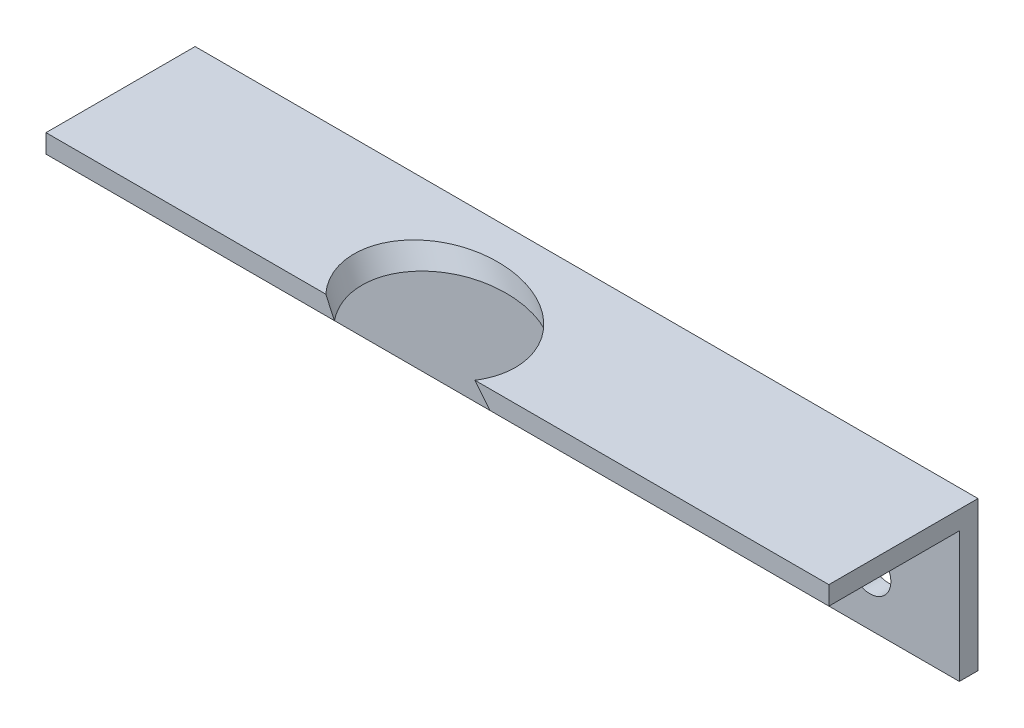
ISO-10303-21;
HEADER;
FILE_DESCRIPTION(('STEP AP214'),'2;1');
FILE_NAME('part.step','',(''),(''),'','','');
FILE_SCHEMA(('AUTOMOTIVE_DESIGN { 1 0 10303 214 1 1 1 1 }'));
ENDSEC;
DATA;
#1=APPLICATION_CONTEXT('core data for automotive mechanical design processes');
#2=APPLICATION_PROTOCOL_DEFINITION('international standard','automotive_design',2000,#1);
#3=PRODUCT_CONTEXT('',#1,'mechanical');
#4=PRODUCT('Part','Part','',(#3));
#5=PRODUCT_RELATED_PRODUCT_CATEGORY('part','',(#4));
#6=PRODUCT_DEFINITION_FORMATION('','',#4);
#7=PRODUCT_DEFINITION_CONTEXT('part definition',#1,'design');
#8=PRODUCT_DEFINITION('design','',#6,#7);
#9=PRODUCT_DEFINITION_SHAPE('','',#8);
#10=(LENGTH_UNIT() NAMED_UNIT(*) SI_UNIT(.MILLI.,.METRE.));
#11=(NAMED_UNIT(*) PLANE_ANGLE_UNIT() SI_UNIT($,.RADIAN.));
#12=(NAMED_UNIT(*) SI_UNIT($,.STERADIAN.) SOLID_ANGLE_UNIT());
#13=UNCERTAINTY_MEASURE_WITH_UNIT(LENGTH_MEASURE(1.E-05),#10,'distance_accuracy_value','');
#14=(GEOMETRIC_REPRESENTATION_CONTEXT(3) GLOBAL_UNCERTAINTY_ASSIGNED_CONTEXT((#13)) GLOBAL_UNIT_ASSIGNED_CONTEXT((#10,
#11,#12)) REPRESENTATION_CONTEXT('',''));
#15=CARTESIAN_POINT('',(0.,0.,0.));
#16=DIRECTION('',(0.,0.,1.));
#17=DIRECTION('',(1.,0.,0.));
#18=AXIS2_PLACEMENT_3D('',#15,#16,#17);
#19=CARTESIAN_POINT('',(133.35,25.4,25.4));
#20=DIRECTION('',(0.,0.,-1.));
#21=DIRECTION('',(0.,1.,0.));
#22=AXIS2_PLACEMENT_3D('',#19,#20,#21);
#23=PLANE('',#22);
#24=DIRECTION('',(-1.,0.,0.));
#25=VECTOR('',#24,1.);
#26=CARTESIAN_POINT('',(133.35,25.4,25.4));
#27=LINE('',#26,#25);
#28=CARTESIAN_POINT('',(133.35,25.4,25.4));
#29=VERTEX_POINT('',#28);
#30=CARTESIAN_POINT('',(73.0648161363002,25.4,25.4));
#31=VERTEX_POINT('',#30);
#32=EDGE_CURVE('E169',#29,#31,#27,.T.);
#33=ORIENTED_EDGE('',*,*,#32,.T.);
#34=CARTESIAN_POINT('',(73.0648161363002,25.4,25.4));
#35=CARTESIAN_POINT('',(73.2070336013631,25.2247044358889,25.4));
#36=CARTESIAN_POINT('',(73.3490179533257,25.0492197795969,25.4));
#37=CARTESIAN_POINT('',(73.6325244490646,24.6978812985424,25.4));
#38=CARTESIAN_POINT('',(73.7740465988834,24.522027478656,25.4));
#39=CARTESIAN_POINT('',(74.0566355429504,24.1699562036177,25.4));
#40=CARTESIAN_POINT('',(74.1977023400888,23.9937387507857,25.4));
#41=CARTESIAN_POINT('',(74.479386965378,23.640945447082,25.4));
#42=CARTESIAN_POINT('',(74.620004793638,23.4643695962976,25.4));
#43=CARTESIAN_POINT('',(74.9007977315109,23.1108643466204,25.4));
#44=CARTESIAN_POINT('',(75.0409728381942,22.9339349454006,25.4));
#45=CARTESIAN_POINT('',(75.3208861592879,22.5797271952436,25.4));
#46=CARTESIAN_POINT('',(75.4606243680735,22.4024488418614,25.4));
#47=CARTESIAN_POINT('',(75.6001457103721,22.225,25.4));
#48=B_SPLINE_CURVE_WITH_KNOTS('',3,(#34,#35,#36,#37,#38,#39,#40,#41,#42,#43,#44,#45,#46,#47),
.UNSPECIFIED.,.F.,.F.,(4,2,2,2,2,2,4),(0.,0.677191818269251,1.35437474757687,2.03155336996906,
2.70873182749302,3.38591475678608,4.06310636882168),.UNSPECIFIED.);
#49=CARTESIAN_POINT('',(75.6001457103721,22.225,25.4));
#50=VERTEX_POINT('',#49);
#51=EDGE_CURVE('E211',#31,#50,#48,.T.);
#52=ORIENTED_EDGE('',*,*,#51,.T.);
#53=DIRECTION('',(-1.,0.,0.));
#54=VECTOR('',#53,1.);
#55=CARTESIAN_POINT('',(133.35,22.225,25.4));
#56=LINE('',#55,#54);
#57=CARTESIAN_POINT('',(133.35,22.225,25.4));
#58=VERTEX_POINT('',#57);
#59=EDGE_CURVE('E165',#58,#50,#56,.T.);
#60=ORIENTED_EDGE('',*,*,#59,.F.);
#61=DIRECTION('',(0.,-1.,0.));
#62=VECTOR('',#61,1.);
#63=CARTESIAN_POINT('',(133.35,25.4,25.4));
#64=LINE('',#63,#62);
#65=EDGE_CURVE('E115',#29,#58,#64,.T.);
#66=ORIENTED_EDGE('',*,*,#65,.F.);
#67=EDGE_LOOP('',(#33,#52,#60,#66));
#68=FACE_BOUND('',#67,.T.);
#69=ADVANCED_FACE('F37',(#68),#23,.F.);
#70=CARTESIAN_POINT('',(133.35,0.,0.));
#71=DIRECTION('',(0.,0.,1.));
#72=DIRECTION('',(1.,0.,0.));
#73=AXIS2_PLACEMENT_3D('',#70,#71,#72);
#74=PLANE('',#73);
#75=CARTESIAN_POINT('',(118.11,8.89000000000001,0.));
#76=DIRECTION('',(0.,0.,-1.));
#77=DIRECTION('',(-1.,0.,0.));
#78=AXIS2_PLACEMENT_3D('',#75,#76,#77);
#79=CIRCLE('',#78,3.57124000000001);
#80=CARTESIAN_POINT('',(114.53876,8.89000000000001,0.));
#81=VERTEX_POINT('',#80);
#82=EDGE_CURVE('E251',#81,#81,#79,.T.);
#83=ORIENTED_EDGE('',*,*,#82,.F.);
#84=EDGE_LOOP('',(#83));
#85=FACE_BOUND('',#84,.T.);
#86=CARTESIAN_POINT('',(15.24,8.89000000000001,0.));
#87=DIRECTION('',(0.,0.,-1.));
#88=DIRECTION('',(-1.,0.,0.));
#89=AXIS2_PLACEMENT_3D('',#86,#87,#88);
#90=CIRCLE('',#89,3.57124);
#91=CARTESIAN_POINT('',(11.66876,8.89000000000001,0.));
#92=VERTEX_POINT('',#91);
#93=EDGE_CURVE('E254',#92,#92,#90,.T.);
#94=ORIENTED_EDGE('',*,*,#93,.F.);
#95=EDGE_LOOP('',(#94));
#96=FACE_BOUND('',#95,.T.);
#97=DIRECTION('',(0.,1.,0.));
#98=VECTOR('',#97,1.);
#99=CARTESIAN_POINT('',(0.,0.,0.));
#100=LINE('',#99,#98);
#101=CARTESIAN_POINT('',(0.,0.,0.));
#102=VERTEX_POINT('',#101);
#103=CARTESIAN_POINT('',(0.,25.4,0.));
#104=VERTEX_POINT('',#103);
#105=EDGE_CURVE('E140',#102,#104,#100,.T.);
#106=ORIENTED_EDGE('',*,*,#105,.T.);
#107=DIRECTION('',(-1.,0.,0.));
#108=VECTOR('',#107,1.);
#109=CARTESIAN_POINT('',(133.35,25.4,0.));
#110=LINE('',#109,#108);
#111=CARTESIAN_POINT('',(133.35,25.4,0.));
#112=VERTEX_POINT('',#111);
#113=EDGE_CURVE('E47',#112,#104,#110,.T.);
#114=ORIENTED_EDGE('',*,*,#113,.F.);
#115=DIRECTION('',(0.,1.,0.));
#116=VECTOR('',#115,1.);
#117=CARTESIAN_POINT('',(133.35,0.,0.));
#118=LINE('',#117,#116);
#119=CARTESIAN_POINT('',(133.35,0.,0.));
#120=VERTEX_POINT('',#119);
#121=EDGE_CURVE('E160',#120,#112,#118,.T.);
#122=ORIENTED_EDGE('',*,*,#121,.F.);
#123=DIRECTION('',(-1.,0.,0.));
#124=VECTOR('',#123,1.);
#125=CARTESIAN_POINT('',(133.35,0.,0.));
#126=LINE('',#125,#124);
#127=EDGE_CURVE('E136',#120,#102,#126,.T.);
#128=ORIENTED_EDGE('',*,*,#127,.T.);
#129=EDGE_LOOP('',(#106,#114,#122,#128));
#130=FACE_BOUND('',#129,.T.);
#131=ADVANCED_FACE('F39',(#85,#96,#130),#74,.F.);
#132=CARTESIAN_POINT('',(133.35,25.4,0.));
#133=DIRECTION('',(0.,-1.,0.));
#134=DIRECTION('',(0.,0.,-1.));
#135=AXIS2_PLACEMENT_3D('',#132,#133,#134);
#136=PLANE('',#135);
#137=CARTESIAN_POINT('',(47.651098940411,25.4,25.4));
#138=VERTEX_POINT('',#137);
#139=CARTESIAN_POINT('',(0.,25.4,25.4));
#140=VERTEX_POINT('',#139);
#141=EDGE_CURVE('E168',#138,#140,#27,.T.);
#142=ORIENTED_EDGE('',*,*,#141,.F.);
#143=CARTESIAN_POINT('',(47.651098940411,25.4,25.4));
#144=CARTESIAN_POINT('',(47.3957745346794,25.4,25.1241435050767));
#145=CARTESIAN_POINT('',(47.1503502529683,25.4,24.8389554639527));
#146=CARTESIAN_POINT('',(46.6816118515027,25.4,24.2504210438661));
#147=CARTESIAN_POINT('',(46.4583244209419,25.4,23.9470534368024));
#148=CARTESIAN_POINT('',(46.0354741172725,25.4,23.3213783581046));
#149=CARTESIAN_POINT('',(45.8360681145288,25.3999999999999,22.9989644370529));
#150=CARTESIAN_POINT('',(45.4656079118157,25.4000000000001,22.338364644139));
#151=CARTESIAN_POINT('',(45.2945401507536,25.4000000000003,22.0001864160526));
#152=CARTESIAN_POINT('',(45.0093621175642,25.4000000000003,21.3667068007728));
#153=CARTESIAN_POINT('',(44.8905111916545,25.4000000000001,21.0735360046358));
#154=CARTESIAN_POINT('',(44.676441193358,25.3999999999999,20.4787063660787));
#155=CARTESIAN_POINT('',(44.5812177242553,25.4,20.1770491145106));
#156=CARTESIAN_POINT('',(44.416324877774,25.4,19.5675360482811));
#157=CARTESIAN_POINT('',(44.3465978900992,25.4,19.2596958868446));
#158=CARTESIAN_POINT('',(44.2340052086818,25.4,18.6391119520649));
#159=CARTESIAN_POINT('',(44.1911393066595,25.4,18.3263682167631));
#160=CARTESIAN_POINT('',(44.1334341716628,25.4,17.6959913162075));
#161=CARTESIAN_POINT('',(44.1188000107815,25.4,17.3783391458675));
#162=CARTESIAN_POINT('',(44.1192180869035,25.4,16.743023621244));
#163=CARTESIAN_POINT('',(44.1342707915166,25.4,16.4253602668632));
#164=CARTESIAN_POINT('',(44.1946261042405,25.4,15.7928825186459));
#165=CARTESIAN_POINT('',(44.2399308519523,25.4,15.4780683279153));
#166=CARTESIAN_POINT('',(44.3607911157029,25.4,14.8543143122505));
#167=CARTESIAN_POINT('',(44.4363434089798,25.3999999999999,14.5453738651631));
#168=CARTESIAN_POINT('',(44.6070661478737,25.3999999999999,13.9700389724805));
#169=CARTESIAN_POINT('',(44.6991395790599,25.4,13.7027201868495));
#170=CARTESIAN_POINT('',(44.9058959114281,25.4,13.1769973519833));
#171=CARTESIAN_POINT('',(45.0205768437646,25.4,12.9185925287485));
#172=CARTESIAN_POINT('',(45.2713920063703,25.4,12.4124921980199));
#173=CARTESIAN_POINT('',(45.4075220603384,25.4,12.1647946176869));
#174=CARTESIAN_POINT('',(45.6998627277487,25.4,11.6815549796125));
#175=CARTESIAN_POINT('',(45.8560739322806,25.3999999999999,11.446013279966));
#176=CARTESIAN_POINT('',(46.1862957883442,25.3999999999999,10.9892972120463));
#177=CARTESIAN_POINT('',(46.3602283904693,25.4,10.768066308643));
#178=CARTESIAN_POINT('',(46.7247715264638,25.4,10.3398334927784));
#179=CARTESIAN_POINT('',(46.9153818160247,25.4,10.1328313719617));
#180=CARTESIAN_POINT('',(47.3115939760528,25.4,9.73371877781506));
#181=CARTESIAN_POINT('',(47.5171965201907,25.4,9.54160897446642));
#182=CARTESIAN_POINT('',(47.9417804404931,25.4,9.17266413512444));
#183=CARTESIAN_POINT('',(48.1607667933561,25.4,8.99583484083409));
#184=CARTESIAN_POINT('',(48.6367570760347,25.4,8.63797730683725));
#185=CARTESIAN_POINT('',(48.8952114743451,25.4,8.45887808009613));
#186=CARTESIAN_POINT('',(49.4246767425631,25.4,8.12016614937321));
#187=CARTESIAN_POINT('',(49.6956920745958,25.4,7.96056044457287));
#188=CARTESIAN_POINT('',(50.2483202489952,25.4,7.66075383994852));
#189=CARTESIAN_POINT('',(50.5299358327953,25.4,7.52055800436588));
#190=CARTESIAN_POINT('',(51.1019098824199,25.4,7.25937431043989));
#191=CARTESIAN_POINT('',(51.3922685003664,25.4,7.13838678653627));
#192=CARTESIAN_POINT('',(52.0355869492545,25.4,6.89422992959515));
#193=CARTESIAN_POINT('',(52.3900265039483,25.4,6.77495153639395));
#194=CARTESIAN_POINT('',(53.1066209038311,25.4,6.56236407408152));
#195=CARTESIAN_POINT('',(53.4687770576098,25.4,6.46905944797704));
#196=CARTESIAN_POINT('',(54.1988294376026,25.4,6.30767849873315));
#197=CARTESIAN_POINT('',(54.5667280100647,25.4,6.23961278469015));
#198=CARTESIAN_POINT('',(55.30615174063,25.4,6.12803442053704));
#199=CARTESIAN_POINT('',(55.6776772692381,25.4,6.0845243061314));
#200=CARTESIAN_POINT('',(56.9486191877868,25.4000000000001,5.97681181626898));
#201=CARTESIAN_POINT('',(57.8536996832355,25.4,5.96994211136881));
#202=CARTESIAN_POINT('',(59.2038667292724,25.4,6.05713042602846));
#203=CARTESIAN_POINT('',(59.6529496108058,25.4,6.10249903082242));
#204=CARTESIAN_POINT('',(60.5467942217753,25.4,6.22486014381137));
#205=CARTESIAN_POINT('',(60.9915557644664,25.4,6.30185401251277));
#206=CARTESIAN_POINT('',(62.4542311215869,25.4,6.60816579005159));
#207=CARTESIAN_POINT('',(63.4592313451971,25.4,6.90485829134611));
#208=CARTESIAN_POINT('',(64.9201185566939,25.4,7.46807740507603));
#209=CARTESIAN_POINT('',(65.3997725533471,25.4,7.67578332709123));
#210=CARTESIAN_POINT('',(66.340442724342,25.4,8.13022535329702));
#211=CARTESIAN_POINT('',(66.8014593700985,25.3999999999999,8.37696046950333));
#212=CARTESIAN_POINT('',(67.7168543427941,25.3999999999999,8.9183208905547));
#213=CARTESIAN_POINT('',(68.1704083223577,25.4,9.21434125930097));
#214=CARTESIAN_POINT('',(69.0484935460787,25.4,9.84698369114202));
#215=CARTESIAN_POINT('',(69.4730195813463,25.4,10.1836130114672));
#216=CARTESIAN_POINT('',(70.2865698955632,25.4,10.8958150464788));
#217=CARTESIAN_POINT('',(70.6756665621386,25.4000000000001,11.271304847203));
#218=CARTESIAN_POINT('',(71.4129091017594,25.3999999999999,12.0604392441411));
#219=CARTESIAN_POINT('',(71.7610782588166,25.3999999999998,12.474061904899));
#220=CARTESIAN_POINT('',(72.2978439893038,25.3999999999998,13.1889275349846));
#221=CARTESIAN_POINT('',(72.5001599039683,25.3999999999999,13.479941529146));
#222=CARTESIAN_POINT('',(72.8818061894936,25.4,14.0766353915728));
#223=CARTESIAN_POINT('',(73.0611429458664,25.4,14.3823111529956));
#224=CARTESIAN_POINT('',(73.3944165432353,25.4,15.0071498752301));
#225=CARTESIAN_POINT('',(73.5483596577557,25.4,15.3263094802965));
#226=CARTESIAN_POINT('',(73.828401430225,25.4,15.9766850907509));
#227=CARTESIAN_POINT('',(73.9544989106838,25.4000000000001,16.3079016052919));
#228=CARTESIAN_POINT('',(74.1773597839842,25.4000000000001,16.9835885326796));
#229=CARTESIAN_POINT('',(74.2738352892753,25.4,17.3281544883002));
#230=CARTESIAN_POINT('',(74.433351199548,25.4,18.0249836957624));
#231=CARTESIAN_POINT('',(74.4963907491147,25.4,18.3772471442943));
#232=CARTESIAN_POINT('',(74.5868042281271,25.4,19.0861603107788));
#233=CARTESIAN_POINT('',(74.6142066487967,25.4,19.4428062943962));
#234=CARTESIAN_POINT('',(74.6273915130932,25.4,19.9782769850329));
#235=CARTESIAN_POINT('',(74.6271336695838,25.4,20.156846689583));
#236=CARTESIAN_POINT('',(74.6171875416403,25.4,20.5137851484772));
#237=CARTESIAN_POINT('',(74.6074963362539,25.4,20.6921538234476));
#238=CARTESIAN_POINT('',(74.5684745149755,25.4000000000001,21.1723946163316));
#239=CARTESIAN_POINT('',(74.5301577030664,25.4,21.4735808516351));
#240=CARTESIAN_POINT('',(74.4259069505556,25.4,22.0711183743775));
#241=CARTESIAN_POINT('',(74.3599763400528,25.4,22.3674702403436));
#242=CARTESIAN_POINT('',(74.2407643794668,25.4,22.8062286656857));
#243=CARTESIAN_POINT('',(74.1976617600681,25.4,22.951464546165));
#244=CARTESIAN_POINT('',(74.1047970442933,25.4,23.2397467435607));
#245=CARTESIAN_POINT('',(74.0550366530686,25.4,23.3827936106959));
#246=CARTESIAN_POINT('',(73.8959607927593,25.4,23.8081498286697));
#247=CARTESIAN_POINT('',(73.7767994864737,25.3999999999999,24.0868627850923));
#248=CARTESIAN_POINT('',(73.5587953191721,25.3999999999999,24.5386531775513));
#249=CARTESIAN_POINT('',(73.4669926650247,25.4,24.7151869092686));
#250=CARTESIAN_POINT('',(73.2733436861968,25.4,25.0621649954835));
#251=CARTESIAN_POINT('',(73.1715192008577,25.4000000000001,25.2326215346914));
#252=CARTESIAN_POINT('',(73.0648161363003,25.4000000000001,25.4));
#253=B_SPLINE_CURVE_WITH_KNOTS('',3,(#143,#144,#145,#146,#147,#148,#149,#150,#151,#152,#153,
#154,#155,#156,#157,#158,#159,#160,#161,#162,#163,#164,#165,#166,#167,#168,#169,#170,#171,#172,
#173,#174,#175,#176,#177,#178,#179,#180,#181,#182,#183,#184,#185,#186,#187,#188,#189,#190,#191,
#192,#193,#194,#195,#196,#197,#198,#199,#200,#201,#202,#203,#204,#205,#206,#207,#208,#209,#210,
#211,#212,#213,#214,#215,#216,#217,#218,#219,#220,#221,#222,#223,#224,#225,#226,#227,#228,#229,
#230,#231,#232,#233,#234,#235,#236,#237,#238,#239,#240,#241,#242,#243,#244,#245,#246,#247,#248,
#249,#250,#251,#252),.UNSPECIFIED.,.F.,.F.,(4,2,2,2,2,2,2,2,2,2,2,2,2,2,2,2,2,2,2,2,2,2,2,2,2,2,
2,2,2,2,2,2,2,2,2,2,2,2,2,2,2,2,2,2,2,2,2,2,2,2,2,2,2,2,4),(0.,1.12758668726248,
2.25651672085047,3.39249701992397,4.52793212224962,5.47604740753571,6.4239861302274,
7.36976951574977,8.31554556761839,9.26816613550684,10.2208017086195,11.1735046648099,
12.1261061410954,12.9732695701696,13.8203592539115,14.6672842064377,15.5142340939484,
16.3576030367731,17.2009596273093,18.044354137097,18.8880641895753,19.8304809056186,
20.7732350093562,21.7162346259796,22.6592506595569,23.7800958102409,24.9011325722057,
26.0226400256519,27.1442632690366,29.8474445583232,31.2006738928204,32.5539614488095,
35.6811698352822,37.2479395795039,38.8146696688909,40.4373240324204,42.0602688114886,
43.6798195510239,45.298444408759,46.3608160794819,47.4228918922388,48.4847049238652,
49.546562847092,50.6184358952681,51.6903363645815,52.7613793414505,53.2968760060102,
53.8325385348649,54.7420480629733,55.6514479399243,56.1057946019038,56.5600251211106,
57.4679038780101,58.0645247392434,58.659873092881),.UNSPECIFIED.);
#254=EDGE_CURVE('E145',#138,#31,#253,.T.);
#255=ORIENTED_EDGE('',*,*,#254,.T.);
#256=ORIENTED_EDGE('',*,*,#32,.F.);
#257=DIRECTION('',(0.,0.,1.));
#258=VECTOR('',#257,1.);
#259=CARTESIAN_POINT('',(133.35,25.4,0.));
#260=LINE('',#259,#258);
#261=EDGE_CURVE('E99',#112,#29,#260,.T.);
#262=ORIENTED_EDGE('',*,*,#261,.F.);
#263=ORIENTED_EDGE('',*,*,#113,.T.);
#264=DIRECTION('',(0.,0.,1.));
#265=VECTOR('',#264,1.);
#266=CARTESIAN_POINT('',(0.,25.4,0.));
#267=LINE('',#266,#265);
#268=EDGE_CURVE('E144',#104,#140,#267,.T.);
#269=ORIENTED_EDGE('',*,*,#268,.T.);
#270=EDGE_LOOP('',(#142,#255,#256,#262,#263,#269));
#271=FACE_BOUND('',#270,.T.);
#272=ADVANCED_FACE('F226',(#271),#136,.F.);
#273=CARTESIAN_POINT('',(49.139274790246,22.225,25.4));
#274=VERTEX_POINT('',#273);
#275=CARTESIAN_POINT('',(0.,22.225,25.4));
#276=VERTEX_POINT('',#275);
#277=EDGE_CURVE('E129',#274,#276,#56,.T.);
#278=ORIENTED_EDGE('',*,*,#277,.F.);
#279=CARTESIAN_POINT('',(49.139274790246,22.225,25.4));
#280=CARTESIAN_POINT('',(49.0548339315192,22.4005589164051,25.4));
#281=CARTESIAN_POINT('',(48.9706718742222,22.5762519907989,25.4));
#282=CARTESIAN_POINT('',(48.8029218419449,22.9279070401963,25.4));
#283=CARTESIAN_POINT('',(48.7193338538567,23.1038690089472,25.4));
#284=CARTESIAN_POINT('',(48.5527455740569,23.4560683505842,25.4));
#285=CARTESIAN_POINT('',(48.4697452752669,23.6323057201219,25.4));
#286=CARTESIAN_POINT('',(48.3043469027726,23.9850630101504,25.4));
#287=CARTESIAN_POINT('',(48.2219488295374,24.1615829308613,25.4));
#288=CARTESIAN_POINT('',(48.0577704243886,24.5149122700794,25.4));
#289=CARTESIAN_POINT('',(47.9759900994575,24.6917216918315,25.4));
#290=CARTESIAN_POINT('',(47.8130638220024,25.0456376807681,25.4));
#291=CARTESIAN_POINT('',(47.7319178846769,25.2227442549491,25.4));
#292=CARTESIAN_POINT('',(47.651098940411,25.3999999999999,25.4));
#293=B_SPLINE_CURVE_WITH_KNOTS('',3,(#279,#280,#281,#282,#283,#284,#285,#286,#287,#288,#289,
#290,#291,#292),.UNSPECIFIED.,.F.,.F.,(4,2,2,2,2,2,4),(0.,0.584431801166583,1.16885021324776,
1.75326157435346,2.33767339063365,2.9220918027956,3.50652417367019),.UNSPECIFIED.);
#294=EDGE_CURVE('E55',#274,#138,#293,.T.);
#295=ORIENTED_EDGE('',*,*,#294,.T.);
#296=ORIENTED_EDGE('',*,*,#141,.T.);
#297=DIRECTION('',(0.,-1.,0.));
#298=VECTOR('',#297,1.);
#299=CARTESIAN_POINT('',(0.,25.4,25.4));
#300=LINE('',#299,#298);
#301=EDGE_CURVE('E149',#140,#276,#300,.T.);
#302=ORIENTED_EDGE('',*,*,#301,.T.);
#303=EDGE_LOOP('',(#278,#295,#296,#302));
#304=FACE_BOUND('',#303,.T.);
#305=ADVANCED_FACE('F223',(#304),#23,.F.);
#306=CARTESIAN_POINT('',(133.35,22.225,25.4));
#307=DIRECTION('',(0.,1.,0.));
#308=DIRECTION('',(0.,0.,1.));
#309=AXIS2_PLACEMENT_3D('',#306,#307,#308);
#310=PLANE('',#309);
#311=ORIENTED_EDGE('',*,*,#59,.T.);
#312=CARTESIAN_POINT('',(75.6001457103721,22.225,25.4));
#313=CARTESIAN_POINT('',(75.6880670145939,22.225,25.2332911676519));
#314=CARTESIAN_POINT('',(75.7712781530025,22.225,25.0640925302942));
#315=CARTESIAN_POINT('',(75.9279483283928,22.225,24.7212431208927));
#316=CARTESIAN_POINT('',(76.0014075240744,22.225,24.5475924213553));
#317=CARTESIAN_POINT('',(76.138242995255,22.225,24.1963658622808));
#318=CARTESIAN_POINT('',(76.2016195554785,22.225,24.0187901137448));
#319=CARTESIAN_POINT('',(76.317834197235,22.225,23.6609217636879));
#320=CARTESIAN_POINT('',(76.3707089456721,22.225,23.4806410661931));
#321=CARTESIAN_POINT('',(76.4660157394995,22.225,23.1173438445673));
#322=CARTESIAN_POINT('',(76.5084481464126,22.225,22.9343274153823));
#323=CARTESIAN_POINT('',(76.5827623728104,22.225,22.5661834595431));
#324=CARTESIAN_POINT('',(76.6146445292132,22.2250000000001,22.381056000499));
#325=CARTESIAN_POINT('',(76.6811269591119,22.2250000000001,21.9162350828264));
#326=CARTESIAN_POINT('',(76.7091066112723,22.225,21.6355688819785));
#327=CARTESIAN_POINT('',(76.7413945932452,22.225,21.0728646294393));
#328=CARTESIAN_POINT('',(76.7456984339771,22.225,20.790826327735));
#329=CARTESIAN_POINT('',(76.7311432280949,22.225,20.2272990570953));
#330=CARTESIAN_POINT('',(76.7122793949726,22.225,19.9458102137156));
#331=CARTESIAN_POINT('',(76.6521704452848,22.225,19.3852516661898));
#332=CARTESIAN_POINT('',(76.6109250551405,22.2249999999999,19.1061819916565));
#333=CARTESIAN_POINT('',(76.5057366565993,22.2249999999999,18.5450255682254));
#334=CARTESIAN_POINT('',(76.4412436262306,22.225,18.2630422910923));
#335=CARTESIAN_POINT('',(76.2910231203256,22.225,17.7048120609328));
#336=CARTESIAN_POINT('',(76.2052953643653,22.225,17.4285651837129));
#337=CARTESIAN_POINT('',(76.0139219735387,22.225,16.8830125875514));
#338=CARTESIAN_POINT('',(75.9082720054317,22.225,16.6137083932119));
#339=CARTESIAN_POINT('',(75.6784042844443,22.225,16.0830566372183));
#340=CARTESIAN_POINT('',(75.5541796868097,22.225,15.8217120515947));
#341=CARTESIAN_POINT('',(75.2688647502696,22.2250000000001,15.2698337383222));
#342=CARTESIAN_POINT('',(75.1050392842828,22.225,14.9807130346096));
#343=CARTESIAN_POINT('',(74.7566998453085,22.225,14.4151202247569));
#344=CARTESIAN_POINT('',(74.5721784121924,22.225,14.1386527305194));
#345=CARTESIAN_POINT('',(74.1843457511526,22.225,13.5991600329204));
#346=CARTESIAN_POINT('',(73.9810303827431,22.225,13.3361378115993));
#347=CARTESIAN_POINT('',(73.5574227763884,22.225,12.8241740881206));
#348=CARTESIAN_POINT('',(73.3371302044589,22.225,12.5752328631387));
#349=CARTESIAN_POINT('',(72.8353268407066,22.225,12.0432178893056));
#350=CARTESIAN_POINT('',(72.550413997143,22.225,11.7633476564796));
#351=CARTESIAN_POINT('',(71.961002526024,22.225,11.2250357193339));
#352=CARTESIAN_POINT('',(71.6565006017693,22.225,10.9665976387298));
#353=CARTESIAN_POINT('',(71.0300849745474,22.225,10.4714425707786));
#354=CARTESIAN_POINT('',(70.7081634003361,22.225,10.2347355353124));
#355=CARTESIAN_POINT('',(70.049244244884,22.225,9.78353467040773));
#356=CARTESIAN_POINT('',(69.7122459126932,22.2249999999999,9.56904194919787));
#357=CARTESIAN_POINT('',(68.5459986331681,22.2249999999998,8.87919012431791));
#358=CARTESIAN_POINT('',(67.6845869819461,22.2249999999999,8.45636554866403));
#359=CARTESIAN_POINT('',(66.3536851915992,22.225,7.92176866672949));
#360=CARTESIAN_POINT('',(65.9032237542029,22.225,7.76008997219538));
#361=CARTESIAN_POINT('',(64.9913972530961,22.225,7.47037344009269));
#362=CARTESIAN_POINT('',(64.5300309266999,22.2249999999999,7.34233951928381));
#363=CARTESIAN_POINT('',(63.5419035312509,22.2249999999999,7.10711259909266));
#364=CARTESIAN_POINT('',(63.0140716664628,22.225,7.00441215740501));
#365=CARTESIAN_POINT('',(61.9517521533747,22.225,6.84368787788581));
#366=CARTESIAN_POINT('',(61.4172660931387,22.225,6.78565358030595));
#367=CARTESIAN_POINT('',(60.3457609845426,22.225,6.71574413462616));
#368=CARTESIAN_POINT('',(59.808744792203,22.225,6.70382561254631));
#369=CARTESIAN_POINT('',(58.7349787379153,22.225,6.72779724787579));
#370=CARTESIAN_POINT('',(58.1982301371076,22.225,6.76374978800269));
#371=CARTESIAN_POINT('',(57.2413052193181,22.225,6.87289996165602));
#372=CARTESIAN_POINT('',(56.8200564126003,22.225,6.93681836997066));
#373=CARTESIAN_POINT('',(55.9835604640066,22.225,7.09708261829937));
#374=CARTESIAN_POINT('',(55.5683153853098,22.225,7.19343934188262));
#375=CARTESIAN_POINT('',(54.7476424487439,22.225,7.41947799373035));
#376=CARTESIAN_POINT('',(54.3422005257943,22.225,7.5491086428556));
#377=CARTESIAN_POINT('',(53.5441410629777,22.225,7.84271261175096));
#378=CARTESIAN_POINT('',(53.1515155047198,22.2250000000001,8.00666396401773));
#379=CARTESIAN_POINT('',(52.4567143989418,22.2250000000001,8.3348811057209));
#380=CARTESIAN_POINT('',(52.1516475478776,22.225,8.49304120465574));
#381=CARTESIAN_POINT('',(51.5548630481887,22.225,8.832543404013));
#382=CARTESIAN_POINT('',(51.2631380631544,22.225,9.01387255098071));
#383=CARTESIAN_POINT('',(50.6954612903153,22.225,9.39986560511247));
#384=CARTESIAN_POINT('',(50.419511361639,22.225,9.60453225418086));
#385=CARTESIAN_POINT('',(49.8862334477219,22.225,10.0369703295275));
#386=CARTESIAN_POINT('',(49.6289078857065,22.2250000000001,10.2647447531432));
#387=CARTESIAN_POINT('',(49.1337835000616,22.2250000000001,10.7448171930211));
#388=CARTESIAN_POINT('',(48.8961751959458,22.225,10.9973123167523));
#389=CARTESIAN_POINT('',(48.4462044829113,22.225,11.5239320534497));
#390=CARTESIAN_POINT('',(48.2338418913229,22.225,11.7980565098892));
#391=CARTESIAN_POINT('',(47.8376386701981,22.225,12.3658695822521));
#392=CARTESIAN_POINT('',(47.6537725084652,22.225,12.659540343839));
#393=CARTESIAN_POINT('',(47.3171701528361,22.225,13.2642012066061));
#394=CARTESIAN_POINT('',(47.1644283542458,22.2249999999999,13.5751881767193));
#395=CARTESIAN_POINT('',(46.9122335770051,22.2249999999999,14.164967124127));
#396=CARTESIAN_POINT('',(46.808256773303,22.225,14.4418339306072));
#397=CARTESIAN_POINT('',(46.6257181531815,22.225,15.0038066476637));
#398=CARTESIAN_POINT('',(46.5471534451779,22.225,15.288911616814));
#399=CARTESIAN_POINT('',(46.4160810315608,22.225,15.8649601807755));
#400=CARTESIAN_POINT('',(46.363566381938,22.225,16.1559021981012));
#401=CARTESIAN_POINT('',(46.2847397677326,22.225,16.7413077425051));
#402=CARTESIAN_POINT('',(46.2584276301584,22.225,17.0357712463211));
#403=CARTESIAN_POINT('',(46.2325717262174,22.225,17.6075500983907));
#404=CARTESIAN_POINT('',(46.2314700142747,22.225,17.884797167185));
#405=CARTESIAN_POINT('',(46.2515596755983,22.225,18.4384559511682));
#406=CARTESIAN_POINT('',(46.2727498284507,22.225,18.714867711257));
#407=CARTESIAN_POINT('',(46.3366476834217,22.225,19.2652008071843));
#408=CARTESIAN_POINT('',(46.3793574193678,22.225,19.5391219051375));
#409=CARTESIAN_POINT('',(46.4853249302563,22.225,20.0829487271466));
#410=CARTESIAN_POINT('',(46.5485835420919,22.225,20.3528542871935));
#411=CARTESIAN_POINT('',(46.7001063791349,22.225,20.907685254839));
#412=CARTESIAN_POINT('',(46.7899071546098,22.225,21.1921906489874));
#413=CARTESIAN_POINT('',(46.9905982675402,22.225,21.7537658056917));
#414=CARTESIAN_POINT('',(47.1014974584927,22.225,22.0308323908144));
#415=CARTESIAN_POINT('',(47.3428505724059,22.225,22.5762902902754));
#416=CARTESIAN_POINT('',(47.4733045714225,22.225,22.8446815708671));
#417=CARTESIAN_POINT('',(47.7522839492779,22.225,23.3719156337735));
#418=CARTESIAN_POINT('',(47.9008113569516,22.2250000000001,23.6307573398403));
#419=CARTESIAN_POINT('',(48.2211779190063,22.2250000000002,24.1489919496668));
#420=CARTESIAN_POINT('',(48.3937420710775,22.2250000000001,24.4079356449167));
#421=CARTESIAN_POINT('',(48.7548474913437,22.2249999999999,24.9132818250026));
#422=CARTESIAN_POINT('',(48.9433397515317,22.2249999999998,25.1597192949902));
#423=CARTESIAN_POINT('',(49.139274790246,22.2249999999999,25.4));
#424=B_SPLINE_CURVE_WITH_KNOTS('',3,(#312,#313,#314,#315,#316,#317,#318,#319,#320,#321,#322,
#323,#324,#325,#326,#327,#328,#329,#330,#331,#332,#333,#334,#335,#336,#337,#338,#339,#340,#341,
#342,#343,#344,#345,#346,#347,#348,#349,#350,#351,#352,#353,#354,#355,#356,#357,#358,#359,#360,
#361,#362,#363,#364,#365,#366,#367,#368,#369,#370,#371,#372,#373,#374,#375,#376,#377,#378,#379,
#380,#381,#382,#383,#384,#385,#386,#387,#388,#389,#390,#391,#392,#393,#394,#395,#396,#397,#398,
#399,#400,#401,#402,#403,#404,#405,#406,#407,#408,#409,#410,#411,#412,#413,#414,#415,#416,#417,
#418,#419,#420,#421,#422,#423),.UNSPECIFIED.,.F.,.F.,(4,2,2,2,2,2,2,2,2,2,2,2,2,2,2,2,2,2,2,2,2,
2,2,2,2,2,2,2,2,2,2,2,2,2,2,2,2,2,2,2,2,2,2,2,2,2,2,2,2,2,2,2,2,2,2,4),(0.,0.565350968368145,
1.13069273526909,1.69601853460152,2.25933440083838,2.82263076185749,3.38590913249189,
4.2310031743352,5.07625744572674,5.92168637846654,6.76712564546151,7.63404368004962,
8.50097316369486,9.36809142941327,10.2355300194598,11.2315028970911,12.2278359468638,
13.2243890239939,14.220961710832,15.4179464066048,16.6151330758408,17.8128652981748,
19.0106572442616,21.8759383722366,23.3108002485836,24.7458290905923,26.3571497682875,
27.9680929981097,29.5775206938724,31.1890477539393,32.4660937723136,33.7435686876162,
35.0190865579293,36.2937904957732,37.3237227534842,38.3530816911937,39.3825616923102,
40.4121753996698,41.4507964729658,42.4894100306828,43.5270875648744,44.564578074684,
45.4506544355101,46.3366299362416,47.2223691406675,48.108102497313,48.9389410944896,
49.769734208063,50.6006058550702,51.4315113451911,52.3256469597799,53.2201586100884,
54.1146737395744,55.0092893758606,55.9421383378165,56.8722148838511),.UNSPECIFIED.);
#425=EDGE_CURVE('E11',#50,#274,#424,.T.);
#426=ORIENTED_EDGE('',*,*,#425,.T.);
#427=ORIENTED_EDGE('',*,*,#277,.T.);
#428=DIRECTION('',(0.,0.,-1.));
#429=VECTOR('',#428,1.);
#430=CARTESIAN_POINT('',(0.,22.225,25.4));
#431=LINE('',#430,#429);
#432=CARTESIAN_POINT('',(0.,22.225,3.175));
#433=VERTEX_POINT('',#432);
#434=EDGE_CURVE('E125',#276,#433,#431,.T.);
#435=ORIENTED_EDGE('',*,*,#434,.T.);
#436=DIRECTION('',(-1.,0.,0.));
#437=VECTOR('',#436,1.);
#438=CARTESIAN_POINT('',(133.35,22.225,3.175));
#439=LINE('',#438,#437);
#440=CARTESIAN_POINT('',(133.35,22.225,3.175));
#441=VERTEX_POINT('',#440);
#442=EDGE_CURVE('E122',#441,#433,#439,.T.);
#443=ORIENTED_EDGE('',*,*,#442,.F.);
#444=DIRECTION('',(0.,0.,-1.));
#445=VECTOR('',#444,1.);
#446=CARTESIAN_POINT('',(133.35,22.225,25.4));
#447=LINE('',#446,#445);
#448=EDGE_CURVE('E108',#58,#441,#447,.T.);
#449=ORIENTED_EDGE('',*,*,#448,.F.);
#450=EDGE_LOOP('',(#311,#426,#427,#435,#443,#449));
#451=FACE_BOUND('',#450,.T.);
#452=ADVANCED_FACE('F123',(#451),#310,.F.);
#453=CARTESIAN_POINT('',(133.35,22.225,3.175));
#454=DIRECTION('',(0.,0.,-1.));
#455=DIRECTION('',(0.,1.,0.));
#456=AXIS2_PLACEMENT_3D('',#453,#454,#455);
#457=PLANE('',#456);
#458=CARTESIAN_POINT('',(118.11,8.89000000000001,3.175));
#459=DIRECTION('',(0.,0.,-1.));
#460=DIRECTION('',(0.,1.,0.));
#461=AXIS2_PLACEMENT_3D('',#458,#459,#460);
#462=CIRCLE('',#461,3.57124000000001);
#463=CARTESIAN_POINT('',(118.11,12.46124,3.175));
#464=VERTEX_POINT('',#463);
#465=EDGE_CURVE('E41',#464,#464,#462,.T.);
#466=ORIENTED_EDGE('',*,*,#465,.T.);
#467=EDGE_LOOP('',(#466));
#468=FACE_BOUND('',#467,.T.);
#469=CARTESIAN_POINT('',(15.24,8.89000000000001,3.175));
#470=DIRECTION('',(0.,0.,-1.));
#471=DIRECTION('',(0.,1.,0.));
#472=AXIS2_PLACEMENT_3D('',#469,#470,#471);
#473=CIRCLE('',#472,3.57124);
#474=CARTESIAN_POINT('',(15.24,12.46124,3.175));
#475=VERTEX_POINT('',#474);
#476=EDGE_CURVE('E180',#475,#475,#473,.T.);
#477=ORIENTED_EDGE('',*,*,#476,.T.);
#478=EDGE_LOOP('',(#477));
#479=FACE_BOUND('',#478,.T.);
#480=DIRECTION('',(0.,-1.,0.));
#481=VECTOR('',#480,1.);
#482=CARTESIAN_POINT('',(0.,22.225,3.175));
#483=LINE('',#482,#481);
#484=CARTESIAN_POINT('',(0.,0.,3.175));
#485=VERTEX_POINT('',#484);
#486=EDGE_CURVE('E155',#433,#485,#483,.T.);
#487=ORIENTED_EDGE('',*,*,#486,.T.);
#488=DIRECTION('',(-1.,0.,0.));
#489=VECTOR('',#488,1.);
#490=CARTESIAN_POINT('',(133.35,0.,3.175));
#491=LINE('',#490,#489);
#492=CARTESIAN_POINT('',(133.35,0.,3.175));
#493=VERTEX_POINT('',#492);
#494=EDGE_CURVE('E130',#493,#485,#491,.T.);
#495=ORIENTED_EDGE('',*,*,#494,.F.);
#496=DIRECTION('',(0.,-1.,0.));
#497=VECTOR('',#496,1.);
#498=CARTESIAN_POINT('',(133.35,22.225,3.175));
#499=LINE('',#498,#497);
#500=EDGE_CURVE('E112',#441,#493,#499,.T.);
#501=ORIENTED_EDGE('',*,*,#500,.F.);
#502=ORIENTED_EDGE('',*,*,#442,.T.);
#503=EDGE_LOOP('',(#487,#495,#501,#502));
#504=FACE_BOUND('',#503,.T.);
#505=ADVANCED_FACE('F132',(#468,#479,#504),#457,.F.);
#506=CARTESIAN_POINT('',(133.35,0.,3.175));
#507=DIRECTION('',(0.,1.,0.));
#508=DIRECTION('',(0.,0.,1.));
#509=AXIS2_PLACEMENT_3D('',#506,#507,#508);
#510=PLANE('',#509);
#511=DIRECTION('',(0.,0.,-1.));
#512=VECTOR('',#511,1.);
#513=CARTESIAN_POINT('',(0.,0.,3.175));
#514=LINE('',#513,#512);
#515=EDGE_CURVE('E90',#485,#102,#514,.T.);
#516=ORIENTED_EDGE('',*,*,#515,.T.);
#517=ORIENTED_EDGE('',*,*,#127,.F.);
#518=DIRECTION('',(0.,0.,-1.));
#519=VECTOR('',#518,1.);
#520=CARTESIAN_POINT('',(133.35,0.,3.175));
#521=LINE('',#520,#519);
#522=EDGE_CURVE('E63',#493,#120,#521,.T.);
#523=ORIENTED_EDGE('',*,*,#522,.F.);
#524=ORIENTED_EDGE('',*,*,#494,.T.);
#525=EDGE_LOOP('',(#516,#517,#523,#524));
#526=FACE_BOUND('',#525,.T.);
#527=ADVANCED_FACE('F271',(#526),#510,.F.);
#528=CARTESIAN_POINT('',(133.35,0.,0.));
#529=DIRECTION('',(1.,0.,0.));
#530=DIRECTION('',(0.,0.,-1.));
#531=AXIS2_PLACEMENT_3D('',#528,#529,#530);
#532=PLANE('',#531);
#533=ORIENTED_EDGE('',*,*,#121,.T.);
#534=ORIENTED_EDGE('',*,*,#261,.T.);
#535=ORIENTED_EDGE('',*,*,#65,.T.);
#536=ORIENTED_EDGE('',*,*,#448,.T.);
#537=ORIENTED_EDGE('',*,*,#500,.T.);
#538=ORIENTED_EDGE('',*,*,#522,.T.);
#539=EDGE_LOOP('',(#533,#534,#535,#536,#537,#538));
#540=FACE_BOUND('',#539,.T.);
#541=ADVANCED_FACE('F110',(#540),#532,.T.);
#542=CARTESIAN_POINT('',(0.,0.,0.));
#543=DIRECTION('',(1.,0.,0.));
#544=DIRECTION('',(0.,0.,-1.));
#545=AXIS2_PLACEMENT_3D('',#542,#543,#544);
#546=PLANE('',#545);
#547=ORIENTED_EDGE('',*,*,#105,.F.);
#548=ORIENTED_EDGE('',*,*,#515,.F.);
#549=ORIENTED_EDGE('',*,*,#486,.F.);
#550=ORIENTED_EDGE('',*,*,#434,.F.);
#551=ORIENTED_EDGE('',*,*,#301,.F.);
#552=ORIENTED_EDGE('',*,*,#268,.F.);
#553=EDGE_LOOP('',(#547,#548,#549,#550,#551,#552));
#554=FACE_BOUND('',#553,.T.);
#555=ADVANCED_FACE('F192',(#554),#546,.F.);
#556=CARTESIAN_POINT('',(317.515141943813,-384.873460741523,110.31489430408));
#557=CARTESIAN_POINT('',(-268.150003509858,494.008408115344,-89.5039532209607));
#558=CARTESIAN_POINT('',(318.529967826348,-386.508323069682,135.64190268636));
#559=CARTESIAN_POINT('',(-267.135177627324,492.373545787184,-64.1769448386803));
#560=CARTESIAN_POINT('',(340.110332701852,-373.11250835612,135.64190268636));
#561=CARTESIAN_POINT('',(-245.554812751819,505.769360500747,-64.1769448386803));
#562=CARTESIAN_POINT('',(339.095506819317,-371.47764602796,110.31489430408));
#563=CARTESIAN_POINT('',(-246.569638634354,507.404222828906,-89.5039532209607));
#564=CARTESIAN_POINT('',(338.080680936782,-369.842783699801,84.9878859217997));
#565=CARTESIAN_POINT('',(-247.584464516889,509.039085157066,-114.830961603241));
#566=CARTESIAN_POINT('',(316.500316061278,-383.238598413363,84.9878859217997));
#567=CARTESIAN_POINT('',(-269.164829392393,495.643270443503,-114.830961603241));
#568=CARTESIAN_POINT('',(317.515141943813,-384.873460741523,110.31489430408));
#569=CARTESIAN_POINT('',(-268.150003509858,494.008408115344,-89.5039532209607));
#570=(BOUNDED_SURFACE() B_SPLINE_SURFACE(3,1,((#556,#557),(#558,#559),(#560,#561),(#562,#563),
(#564,#565),(#566,#567),(#568,#569)),.UNSPECIFIED.,.T.,.F.,.F.) B_SPLINE_SURFACE_WITH_KNOTS((4,
3,4),(2,2),(0.,0.5,1.),(0.,1.),
.UNSPECIFIED.) GEOMETRIC_REPRESENTATION_ITEM() RATIONAL_B_SPLINE_SURFACE(((1.,1.),
(0.333333333333333,0.333333333333333),(0.333333333333333,0.333333333333333),(1.,1.),
(0.333333333333333,0.333333333333333),(0.333333333333333,0.333333333333333),(1.,1.))) REPRESENTATION_ITEM('') SURFACE());
#571=ORIENTED_EDGE('',*,*,#294,.F.);
#572=ORIENTED_EDGE('',*,*,#425,.F.);
#573=ORIENTED_EDGE('',*,*,#51,.F.);
#574=ORIENTED_EDGE('',*,*,#254,.F.);
#575=EDGE_LOOP('',(#571,#572,#573,#574));
#576=FACE_BOUND('',#575,.T.);
#577=ADVANCED_FACE('F184',(#576),#570,.F.);
#578=CARTESIAN_POINT('',(15.24,8.89000000000001,26.7061057870635));
#579=DIRECTION('',(0.,0.,-1.));
#580=DIRECTION('',(-1.,0.,0.));
#581=AXIS2_PLACEMENT_3D('',#578,#579,#580);
#582=CYLINDRICAL_SURFACE('',#581,3.57124);
#583=ORIENTED_EDGE('',*,*,#93,.T.);
#584=EDGE_LOOP('',(#583));
#585=FACE_BOUND('',#584,.T.);
#586=ORIENTED_EDGE('',*,*,#476,.F.);
#587=EDGE_LOOP('',(#586));
#588=FACE_BOUND('',#587,.T.);
#589=ADVANCED_FACE('F191',(#585,#588),#582,.F.);
#590=CARTESIAN_POINT('',(118.11,8.89000000000001,26.7061057870635));
#591=DIRECTION('',(0.,0.,-1.));
#592=DIRECTION('',(-1.,0.,0.));
#593=AXIS2_PLACEMENT_3D('',#590,#591,#592);
#594=CYLINDRICAL_SURFACE('',#593,3.57124000000001);
#595=ORIENTED_EDGE('',*,*,#82,.T.);
#596=EDGE_LOOP('',(#595));
#597=FACE_BOUND('',#596,.T.);
#598=ORIENTED_EDGE('',*,*,#465,.F.);
#599=EDGE_LOOP('',(#598));
#600=FACE_BOUND('',#599,.T.);
#601=ADVANCED_FACE('F300',(#597,#600),#594,.F.);
#602=CLOSED_SHELL('',(#69,#131,#272,#305,#452,#505,#527,#541,#555,#577,#589,#601));
#603=MANIFOLD_SOLID_BREP('B2',#602);
#604=ADVANCED_BREP_SHAPE_REPRESENTATION('',(#18,#603),#14);
#605=SHAPE_DEFINITION_REPRESENTATION(#9,#604);
ENDSEC;
END-ISO-10303-21;
